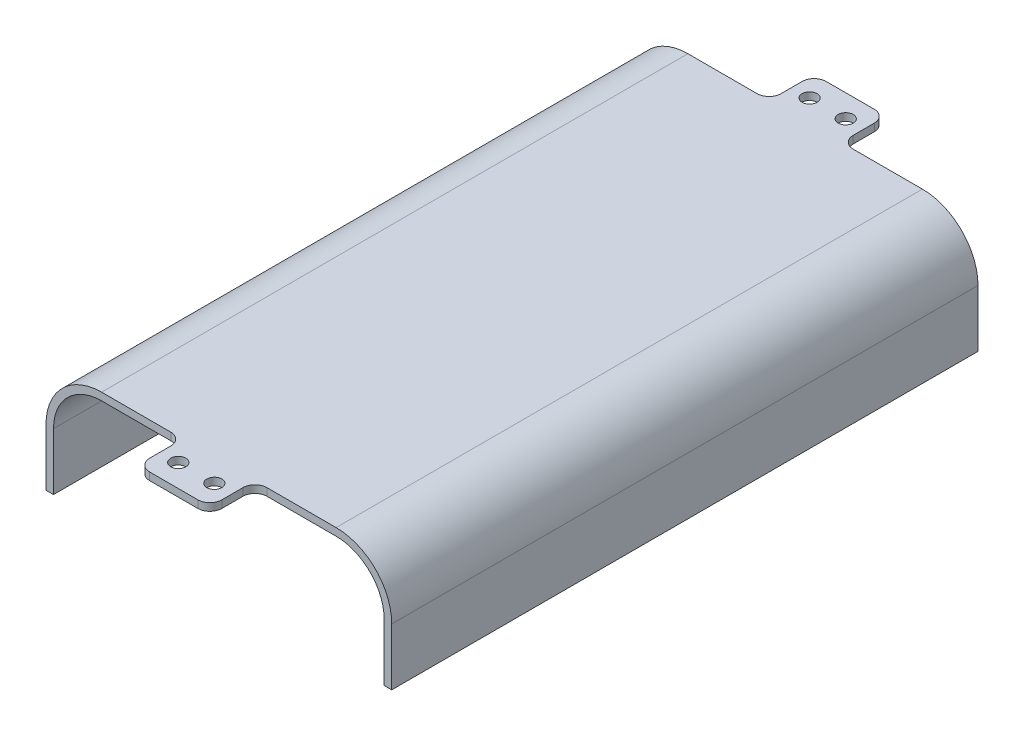
ISO-10303-21;
HEADER;
FILE_DESCRIPTION(('STEP AP214'),'2;1');
FILE_NAME('part.step','',(''),(''),'','','');
FILE_SCHEMA(('AUTOMOTIVE_DESIGN { 1 0 10303 214 1 1 1 1 }'));
ENDSEC;
DATA;
#1=APPLICATION_CONTEXT('core data for automotive mechanical design processes');
#2=APPLICATION_PROTOCOL_DEFINITION('international standard','automotive_design',2000,#1);
#3=PRODUCT_CONTEXT('',#1,'mechanical');
#4=PRODUCT('Part','Part','',(#3));
#5=PRODUCT_RELATED_PRODUCT_CATEGORY('part','',(#4));
#6=PRODUCT_DEFINITION_FORMATION('','',#4);
#7=PRODUCT_DEFINITION_CONTEXT('part definition',#1,'design');
#8=PRODUCT_DEFINITION('design','',#6,#7);
#9=PRODUCT_DEFINITION_SHAPE('','',#8);
#10=(LENGTH_UNIT() NAMED_UNIT(*) SI_UNIT(.MILLI.,.METRE.));
#11=(NAMED_UNIT(*) PLANE_ANGLE_UNIT() SI_UNIT($,.RADIAN.));
#12=(NAMED_UNIT(*) SI_UNIT($,.STERADIAN.) SOLID_ANGLE_UNIT());
#13=UNCERTAINTY_MEASURE_WITH_UNIT(LENGTH_MEASURE(1.E-05),#10,'distance_accuracy_value','');
#14=(GEOMETRIC_REPRESENTATION_CONTEXT(3) GLOBAL_UNCERTAINTY_ASSIGNED_CONTEXT((#13)) GLOBAL_UNIT_ASSIGNED_CONTEXT((#10,
#11,#12)) REPRESENTATION_CONTEXT('',''));
#15=CARTESIAN_POINT('',(0.,0.,0.));
#16=DIRECTION('',(0.,0.,1.));
#17=DIRECTION('',(1.,0.,0.));
#18=AXIS2_PLACEMENT_3D('',#15,#16,#17);
#19=CARTESIAN_POINT('',(-39.,1.50000000000002,225.));
#20=DIRECTION('',(0.,0.,1.));
#21=DIRECTION('',(1.,0.,0.));
#22=AXIS2_PLACEMENT_3D('',#19,#20,#21);
#23=PLANE('',#22);
#24=DIRECTION('',(-1.,0.,0.));
#25=VECTOR('',#24,1.);
#26=CARTESIAN_POINT('',(-39.,20.,225.));
#27=LINE('',#26,#25);
#28=CARTESIAN_POINT('',(7.99999999999997,20.,225.));
#29=VERTEX_POINT('',#28);
#30=CARTESIAN_POINT('',(-7.99999999999997,20.,225.));
#31=VERTEX_POINT('',#30);
#32=EDGE_CURVE('E421',#29,#31,#27,.T.);
#33=ORIENTED_EDGE('',*,*,#32,.T.);
#34=DIRECTION('',(0.,1.,0.));
#35=VECTOR('',#34,1.);
#36=CARTESIAN_POINT('',(-7.99999999999997,-17.5,225.));
#37=LINE('',#36,#35);
#38=CARTESIAN_POINT('',(-7.99999999999997,17.5,225.));
#39=VERTEX_POINT('',#38);
#40=EDGE_CURVE('E277',#39,#31,#37,.T.);
#41=ORIENTED_EDGE('',*,*,#40,.F.);
#42=DIRECTION('',(-1.,0.,0.));
#43=VECTOR('',#42,1.);
#44=CARTESIAN_POINT('',(-39.,17.5,225.));
#45=LINE('',#44,#43);
#46=CARTESIAN_POINT('',(7.99999999999997,17.5,225.));
#47=VERTEX_POINT('',#46);
#48=EDGE_CURVE('E379',#47,#39,#45,.T.);
#49=ORIENTED_EDGE('',*,*,#48,.F.);
#50=DIRECTION('',(0.,1.,0.));
#51=VECTOR('',#50,1.);
#52=CARTESIAN_POINT('',(7.99999999999997,-17.5,225.));
#53=LINE('',#52,#51);
#54=EDGE_CURVE('E336',#47,#29,#53,.T.);
#55=ORIENTED_EDGE('',*,*,#54,.T.);
#56=EDGE_LOOP('',(#33,#41,#49,#55));
#57=FACE_BOUND('',#56,.T.);
#58=ADVANCED_FACE('F41',(#57),#23,.T.);
#59=CARTESIAN_POINT('',(-39.,1.50000000000002,0.));
#60=DIRECTION('',(0.,0.,1.));
#61=DIRECTION('',(1.,0.,0.));
#62=AXIS2_PLACEMENT_3D('',#59,#60,#61);
#63=PLANE('',#62);
#64=DIRECTION('',(0.,1.,0.));
#65=VECTOR('',#64,1.);
#66=CARTESIAN_POINT('',(-7.99999999999997,-17.5,0.));
#67=LINE('',#66,#65);
#68=CARTESIAN_POINT('',(-7.99999999999997,17.5,0.));
#69=VERTEX_POINT('',#68);
#70=CARTESIAN_POINT('',(-7.99999999999997,20.,0.));
#71=VERTEX_POINT('',#70);
#72=EDGE_CURVE('E262',#69,#71,#67,.T.);
#73=ORIENTED_EDGE('',*,*,#72,.T.);
#74=DIRECTION('',(-1.,0.,0.));
#75=VECTOR('',#74,1.);
#76=CARTESIAN_POINT('',(-39.,20.,0.));
#77=LINE('',#76,#75);
#78=CARTESIAN_POINT('',(7.99999999999997,20.,0.));
#79=VERTEX_POINT('',#78);
#80=EDGE_CURVE('E404',#79,#71,#77,.T.);
#81=ORIENTED_EDGE('',*,*,#80,.F.);
#82=DIRECTION('',(0.,1.,0.));
#83=VECTOR('',#82,1.);
#84=CARTESIAN_POINT('',(7.99999999999997,-17.5,0.));
#85=LINE('',#84,#83);
#86=CARTESIAN_POINT('',(7.99999999999997,17.5,0.));
#87=VERTEX_POINT('',#86);
#88=EDGE_CURVE('E272',#87,#79,#85,.T.);
#89=ORIENTED_EDGE('',*,*,#88,.F.);
#90=DIRECTION('',(-1.,0.,0.));
#91=VECTOR('',#90,1.);
#92=CARTESIAN_POINT('',(-39.,17.5,0.));
#93=LINE('',#92,#91);
#94=EDGE_CURVE('E383',#87,#69,#93,.T.);
#95=ORIENTED_EDGE('',*,*,#94,.T.);
#96=EDGE_LOOP('',(#73,#81,#89,#95));
#97=FACE_BOUND('',#96,.T.);
#98=ADVANCED_FACE('F520',(#97),#63,.F.);
#99=CARTESIAN_POINT('',(-55.,-17.5,225.));
#100=DIRECTION('',(0.,1.,0.));
#101=DIRECTION('',(0.,0.,1.));
#102=AXIS2_PLACEMENT_3D('',#99,#100,#101);
#103=PLANE('',#102);
#104=DIRECTION('',(0.,0.,-1.));
#105=VECTOR('',#104,1.);
#106=CARTESIAN_POINT('',(-55.,-17.5,225.));
#107=LINE('',#106,#105);
#108=CARTESIAN_POINT('',(-55.,-17.5,210.));
#109=VERTEX_POINT('',#108);
#110=CARTESIAN_POINT('',(-55.,-17.5,15.));
#111=VERTEX_POINT('',#110);
#112=EDGE_CURVE('E389',#109,#111,#107,.T.);
#113=ORIENTED_EDGE('',*,*,#112,.F.);
#114=DIRECTION('',(-1.,0.,0.));
#115=VECTOR('',#114,1.);
#116=CARTESIAN_POINT('',(-16.,-17.5,210.));
#117=LINE('',#116,#115);
#118=CARTESIAN_POINT('',(-57.5,-17.5,210.));
#119=VERTEX_POINT('',#118);
#120=EDGE_CURVE('E297',#109,#119,#117,.T.);
#121=ORIENTED_EDGE('',*,*,#120,.T.);
#122=DIRECTION('',(0.,0.,-1.));
#123=VECTOR('',#122,1.);
#124=CARTESIAN_POINT('',(-57.5,-17.5,225.));
#125=LINE('',#124,#123);
#126=CARTESIAN_POINT('',(-57.5,-17.5,15.));
#127=VERTEX_POINT('',#126);
#128=EDGE_CURVE('E417',#119,#127,#125,.T.);
#129=ORIENTED_EDGE('',*,*,#128,.T.);
#130=DIRECTION('',(1.,0.,0.));
#131=VECTOR('',#130,1.);
#132=CARTESIAN_POINT('',(-16.,-17.5,15.));
#133=LINE('',#132,#131);
#134=EDGE_CURVE('E237',#127,#111,#133,.T.);
#135=ORIENTED_EDGE('',*,*,#134,.T.);
#136=EDGE_LOOP('',(#113,#121,#129,#135));
#137=FACE_BOUND('',#136,.T.);
#138=ADVANCED_FACE('F499',(#137),#103,.F.);
#139=CARTESIAN_POINT('',(57.5,1.50000000000002,225.));
#140=DIRECTION('',(-1.,0.,0.));
#141=DIRECTION('',(0.,0.,1.));
#142=AXIS2_PLACEMENT_3D('',#139,#140,#141);
#143=PLANE('',#142);
#144=DIRECTION('',(0.,0.,-1.));
#145=VECTOR('',#144,1.);
#146=CARTESIAN_POINT('',(57.5,-17.5,225.));
#147=LINE('',#146,#145);
#148=CARTESIAN_POINT('',(57.5,-17.5,210.));
#149=VERTEX_POINT('',#148);
#150=CARTESIAN_POINT('',(57.5,-17.5,15.));
#151=VERTEX_POINT('',#150);
#152=EDGE_CURVE('E418',#149,#151,#147,.T.);
#153=ORIENTED_EDGE('',*,*,#152,.T.);
#154=DIRECTION('',(0.,1.,0.));
#155=VECTOR('',#154,1.);
#156=CARTESIAN_POINT('',(57.5,1.50000000000002,15.));
#157=LINE('',#156,#155);
#158=CARTESIAN_POINT('',(57.5,1.50000000000002,15.));
#159=VERTEX_POINT('',#158);
#160=EDGE_CURVE('E375',#151,#159,#157,.T.);
#161=ORIENTED_EDGE('',*,*,#160,.T.);
#162=DIRECTION('',(0.,0.,-1.));
#163=VECTOR('',#162,1.);
#164=CARTESIAN_POINT('',(57.5,1.50000000000002,225.));
#165=LINE('',#164,#163);
#166=CARTESIAN_POINT('',(57.5,1.50000000000002,210.));
#167=VERTEX_POINT('',#166);
#168=EDGE_CURVE('E405',#167,#159,#165,.T.);
#169=ORIENTED_EDGE('',*,*,#168,.F.);
#170=DIRECTION('',(0.,-1.,0.));
#171=VECTOR('',#170,1.);
#172=CARTESIAN_POINT('',(57.5,1.50000000000002,210.));
#173=LINE('',#172,#171);
#174=EDGE_CURVE('E365',#167,#149,#173,.T.);
#175=ORIENTED_EDGE('',*,*,#174,.T.);
#176=EDGE_LOOP('',(#153,#161,#169,#175));
#177=FACE_BOUND('',#176,.T.);
#178=ADVANCED_FACE('F559',(#177),#143,.F.);
#179=CARTESIAN_POINT('',(39.,1.50000000000002,225.));
#180=DIRECTION('',(0.,0.,-1.));
#181=DIRECTION('',(-1.,0.,0.));
#182=AXIS2_PLACEMENT_3D('',#179,#180,#181);
#183=CYLINDRICAL_SURFACE('',#182,18.5);
#184=ORIENTED_EDGE('',*,*,#168,.T.);
#185=CARTESIAN_POINT('',(39.,1.50000000000002,15.));
#186=DIRECTION('',(0.,0.,1.));
#187=DIRECTION('',(1.,0.,0.));
#188=AXIS2_PLACEMENT_3D('',#185,#186,#187);
#189=CIRCLE('',#188,18.5);
#190=CARTESIAN_POINT('',(39.,20.,15.));
#191=VERTEX_POINT('',#190);
#192=EDGE_CURVE('E372',#159,#191,#189,.T.);
#193=ORIENTED_EDGE('',*,*,#192,.T.);
#194=DIRECTION('',(0.,0.,-1.));
#195=VECTOR('',#194,1.);
#196=CARTESIAN_POINT('',(39.,20.,225.));
#197=LINE('',#196,#195);
#198=CARTESIAN_POINT('',(39.,20.,210.));
#199=VERTEX_POINT('',#198);
#200=EDGE_CURVE('E409',#199,#191,#197,.T.);
#201=ORIENTED_EDGE('',*,*,#200,.F.);
#202=CARTESIAN_POINT('',(39.,1.50000000000002,210.));
#203=DIRECTION('',(0.,0.,-1.));
#204=DIRECTION('',(-1.,0.,0.));
#205=AXIS2_PLACEMENT_3D('',#202,#203,#204);
#206=CIRCLE('',#205,18.5);
#207=EDGE_CURVE('E362',#199,#167,#206,.T.);
#208=ORIENTED_EDGE('',*,*,#207,.T.);
#209=EDGE_LOOP('',(#184,#193,#201,#208));
#210=FACE_BOUND('',#209,.T.);
#211=ADVANCED_FACE('F561',(#210),#183,.T.);
#212=CARTESIAN_POINT('',(-39.,20.,225.));
#213=DIRECTION('',(0.,-1.,0.));
#214=DIRECTION('',(0.,0.,-1.));
#215=AXIS2_PLACEMENT_3D('',#212,#213,#214);
#216=PLANE('',#215);
#217=CARTESIAN_POINT('',(6.,20.,217.5));
#218=DIRECTION('',(0.,1.,0.));
#219=DIRECTION('',(0.,0.,-1.));
#220=AXIS2_PLACEMENT_3D('',#217,#218,#219);
#221=CIRCLE('',#220,2.5);
#222=CARTESIAN_POINT('',(6.,20.,215.));
#223=VERTEX_POINT('',#222);
#224=EDGE_CURVE('E296',#223,#223,#221,.T.);
#225=ORIENTED_EDGE('',*,*,#224,.F.);
#226=EDGE_LOOP('',(#225));
#227=FACE_BOUND('',#226,.T.);
#228=CARTESIAN_POINT('',(-6.,20.,217.5));
#229=DIRECTION('',(0.,1.,0.));
#230=DIRECTION('',(0.,0.,-1.));
#231=AXIS2_PLACEMENT_3D('',#228,#229,#230);
#232=CIRCLE('',#231,2.5);
#233=CARTESIAN_POINT('',(-6.,20.,215.));
#234=VERTEX_POINT('',#233);
#235=EDGE_CURVE('E293',#234,#234,#232,.T.);
#236=ORIENTED_EDGE('',*,*,#235,.F.);
#237=EDGE_LOOP('',(#236));
#238=FACE_BOUND('',#237,.T.);
#239=CARTESIAN_POINT('',(-6.,20.,7.5));
#240=DIRECTION('',(0.,1.,0.));
#241=DIRECTION('',(0.,0.,1.));
#242=AXIS2_PLACEMENT_3D('',#239,#240,#241);
#243=CIRCLE('',#242,2.5);
#244=CARTESIAN_POINT('',(-6.,20.,10.));
#245=VERTEX_POINT('',#244);
#246=EDGE_CURVE('E287',#245,#245,#243,.T.);
#247=ORIENTED_EDGE('',*,*,#246,.F.);
#248=EDGE_LOOP('',(#247));
#249=FACE_BOUND('',#248,.T.);
#250=CARTESIAN_POINT('',(6.,20.,7.5));
#251=DIRECTION('',(0.,1.,0.));
#252=DIRECTION('',(0.,0.,1.));
#253=AXIS2_PLACEMENT_3D('',#250,#251,#252);
#254=CIRCLE('',#253,2.5);
#255=CARTESIAN_POINT('',(6.,20.,10.));
#256=VERTEX_POINT('',#255);
#257=EDGE_CURVE('E265',#256,#256,#254,.T.);
#258=ORIENTED_EDGE('',*,*,#257,.F.);
#259=EDGE_LOOP('',(#258));
#260=FACE_BOUND('',#259,.T.);
#261=DIRECTION('',(0.,0.,-1.));
#262=VECTOR('',#261,1.);
#263=CARTESIAN_POINT('',(-12.,20.,221.));
#264=LINE('',#263,#262);
#265=CARTESIAN_POINT('',(-12.,20.,221.));
#266=VERTEX_POINT('',#265);
#267=CARTESIAN_POINT('',(-12.,20.,214.));
#268=VERTEX_POINT('',#267);
#269=EDGE_CURVE('E305',#266,#268,#264,.T.);
#270=ORIENTED_EDGE('',*,*,#269,.F.);
#271=CARTESIAN_POINT('',(-8.,20.,221.));
#272=DIRECTION('',(0.,-1.,0.));
#273=DIRECTION('',(0.,0.,1.));
#274=AXIS2_PLACEMENT_3D('',#271,#272,#273);
#275=CIRCLE('',#274,4.);
#276=EDGE_CURVE('E302',#31,#266,#275,.T.);
#277=ORIENTED_EDGE('',*,*,#276,.F.);
#278=ORIENTED_EDGE('',*,*,#32,.F.);
#279=CARTESIAN_POINT('',(8.,20.,221.));
#280=DIRECTION('',(0.,-1.,0.));
#281=DIRECTION('',(0.,0.,-1.));
#282=AXIS2_PLACEMENT_3D('',#279,#280,#281);
#283=CIRCLE('',#282,4.);
#284=CARTESIAN_POINT('',(12.,20.,221.));
#285=VERTEX_POINT('',#284);
#286=EDGE_CURVE('E329',#285,#29,#283,.T.);
#287=ORIENTED_EDGE('',*,*,#286,.F.);
#288=DIRECTION('',(0.,0.,1.));
#289=VECTOR('',#288,1.);
#290=CARTESIAN_POINT('',(12.,20.,221.));
#291=LINE('',#290,#289);
#292=CARTESIAN_POINT('',(12.,20.,214.));
#293=VERTEX_POINT('',#292);
#294=EDGE_CURVE('E327',#293,#285,#291,.T.);
#295=ORIENTED_EDGE('',*,*,#294,.F.);
#296=CARTESIAN_POINT('',(16.,20.,214.));
#297=DIRECTION('',(0.,1.,0.));
#298=DIRECTION('',(0.,0.,1.));
#299=AXIS2_PLACEMENT_3D('',#296,#297,#298);
#300=CIRCLE('',#299,4.00000000000002);
#301=CARTESIAN_POINT('',(16.,20.,210.));
#302=VERTEX_POINT('',#301);
#303=EDGE_CURVE('E290',#302,#293,#300,.T.);
#304=ORIENTED_EDGE('',*,*,#303,.F.);
#305=DIRECTION('',(-1.,0.,0.));
#306=VECTOR('',#305,1.);
#307=CARTESIAN_POINT('',(16.,20.,210.));
#308=LINE('',#307,#306);
#309=EDGE_CURVE('E324',#199,#302,#308,.T.);
#310=ORIENTED_EDGE('',*,*,#309,.F.);
#311=ORIENTED_EDGE('',*,*,#200,.T.);
#312=DIRECTION('',(1.,0.,0.));
#313=VECTOR('',#312,1.);
#314=CARTESIAN_POINT('',(16.,20.,15.));
#315=LINE('',#314,#313);
#316=CARTESIAN_POINT('',(16.,20.,15.));
#317=VERTEX_POINT('',#316);
#318=EDGE_CURVE('E273',#317,#191,#315,.T.);
#319=ORIENTED_EDGE('',*,*,#318,.F.);
#320=CARTESIAN_POINT('',(16.,20.,11.));
#321=DIRECTION('',(0.,1.,0.));
#322=DIRECTION('',(0.,0.,-1.));
#323=AXIS2_PLACEMENT_3D('',#320,#321,#322);
#324=CIRCLE('',#323,4.);
#325=CARTESIAN_POINT('',(12.,20.,11.));
#326=VERTEX_POINT('',#325);
#327=EDGE_CURVE('E280',#326,#317,#324,.T.);
#328=ORIENTED_EDGE('',*,*,#327,.F.);
#329=DIRECTION('',(0.,0.,1.));
#330=VECTOR('',#329,1.);
#331=CARTESIAN_POINT('',(12.,20.,4.));
#332=LINE('',#331,#330);
#333=CARTESIAN_POINT('',(12.,20.,4.));
#334=VERTEX_POINT('',#333);
#335=EDGE_CURVE('E276',#334,#326,#332,.T.);
#336=ORIENTED_EDGE('',*,*,#335,.F.);
#337=CARTESIAN_POINT('',(8.,20.,4.));
#338=DIRECTION('',(0.,-1.,0.));
#339=DIRECTION('',(0.,0.,1.));
#340=AXIS2_PLACEMENT_3D('',#337,#338,#339);
#341=CIRCLE('',#340,4.);
#342=EDGE_CURVE('E274',#79,#334,#341,.T.);
#343=ORIENTED_EDGE('',*,*,#342,.F.);
#344=ORIENTED_EDGE('',*,*,#80,.T.);
#345=CARTESIAN_POINT('',(-8.,20.,4.));
#346=DIRECTION('',(0.,-1.,0.));
#347=DIRECTION('',(0.,0.,-1.));
#348=AXIS2_PLACEMENT_3D('',#345,#346,#347);
#349=CIRCLE('',#348,4.);
#350=CARTESIAN_POINT('',(-12.,20.,4.));
#351=VERTEX_POINT('',#350);
#352=EDGE_CURVE('E247',#351,#71,#349,.T.);
#353=ORIENTED_EDGE('',*,*,#352,.F.);
#354=DIRECTION('',(0.,0.,-1.));
#355=VECTOR('',#354,1.);
#356=CARTESIAN_POINT('',(-12.,20.,4.));
#357=LINE('',#356,#355);
#358=CARTESIAN_POINT('',(-12.,20.,11.));
#359=VERTEX_POINT('',#358);
#360=EDGE_CURVE('E253',#359,#351,#357,.T.);
#361=ORIENTED_EDGE('',*,*,#360,.F.);
#362=CARTESIAN_POINT('',(-16.,20.,11.));
#363=DIRECTION('',(0.,1.,0.));
#364=DIRECTION('',(0.,0.,-1.));
#365=AXIS2_PLACEMENT_3D('',#362,#363,#364);
#366=CIRCLE('',#365,4.);
#367=CARTESIAN_POINT('',(-16.,20.,15.));
#368=VERTEX_POINT('',#367);
#369=EDGE_CURVE('E230',#368,#359,#366,.T.);
#370=ORIENTED_EDGE('',*,*,#369,.F.);
#371=DIRECTION('',(1.,0.,0.));
#372=VECTOR('',#371,1.);
#373=CARTESIAN_POINT('',(-68.033168474898,20.,15.));
#374=LINE('',#373,#372);
#375=CARTESIAN_POINT('',(-39.,20.,15.));
#376=VERTEX_POINT('',#375);
#377=EDGE_CURVE('E240',#376,#368,#374,.T.);
#378=ORIENTED_EDGE('',*,*,#377,.F.);
#379=DIRECTION('',(0.,0.,-1.));
#380=VECTOR('',#379,1.);
#381=CARTESIAN_POINT('',(-39.,20.,225.));
#382=LINE('',#381,#380);
#383=CARTESIAN_POINT('',(-39.,20.,210.));
#384=VERTEX_POINT('',#383);
#385=EDGE_CURVE('E412',#384,#376,#382,.T.);
#386=ORIENTED_EDGE('',*,*,#385,.F.);
#387=DIRECTION('',(-1.,0.,0.));
#388=VECTOR('',#387,1.);
#389=CARTESIAN_POINT('',(-68.033168474898,20.,210.));
#390=LINE('',#389,#388);
#391=CARTESIAN_POINT('',(-16.,20.,210.));
#392=VERTEX_POINT('',#391);
#393=EDGE_CURVE('E301',#392,#384,#390,.T.);
#394=ORIENTED_EDGE('',*,*,#393,.F.);
#395=CARTESIAN_POINT('',(-16.,20.,214.));
#396=DIRECTION('',(0.,1.,0.));
#397=DIRECTION('',(0.,0.,1.));
#398=AXIS2_PLACEMENT_3D('',#395,#396,#397);
#399=CIRCLE('',#398,3.99999999999999);
#400=EDGE_CURVE('E308',#268,#392,#399,.T.);
#401=ORIENTED_EDGE('',*,*,#400,.F.);
#402=EDGE_LOOP('',(#270,#277,#278,#287,#295,#304,#310,#311,#319,#328,#336,#343,#344,#353,#361,
#370,#378,#386,#394,#401));
#403=FACE_BOUND('',#402,.T.);
#404=ADVANCED_FACE('F250',(#227,#238,#249,#260,#403),#216,.F.);
#405=CARTESIAN_POINT('',(-39.,1.50000000000002,225.));
#406=DIRECTION('',(0.,0.,-1.));
#407=DIRECTION('',(-1.,0.,0.));
#408=AXIS2_PLACEMENT_3D('',#405,#406,#407);
#409=CYLINDRICAL_SURFACE('',#408,18.5);
#410=DIRECTION('',(0.,0.,-1.));
#411=VECTOR('',#410,1.);
#412=CARTESIAN_POINT('',(-57.5,1.50000000000002,225.));
#413=LINE('',#412,#411);
#414=CARTESIAN_POINT('',(-57.5,1.50000000000002,210.));
#415=VERTEX_POINT('',#414);
#416=CARTESIAN_POINT('',(-57.5,1.50000000000002,15.));
#417=VERTEX_POINT('',#416);
#418=EDGE_CURVE('E414',#415,#417,#413,.T.);
#419=ORIENTED_EDGE('',*,*,#418,.F.);
#420=CARTESIAN_POINT('',(-39.,1.50000000000002,210.));
#421=DIRECTION('',(0.,0.,-1.));
#422=DIRECTION('',(-1.,0.,0.));
#423=AXIS2_PLACEMENT_3D('',#420,#421,#422);
#424=CIRCLE('',#423,18.5);
#425=EDGE_CURVE('E355',#415,#384,#424,.T.);
#426=ORIENTED_EDGE('',*,*,#425,.T.);
#427=ORIENTED_EDGE('',*,*,#385,.T.);
#428=CARTESIAN_POINT('',(-39.,1.50000000000002,15.));
#429=DIRECTION('',(0.,0.,1.));
#430=DIRECTION('',(1.,0.,0.));
#431=AXIS2_PLACEMENT_3D('',#428,#429,#430);
#432=CIRCLE('',#431,18.5);
#433=EDGE_CURVE('E243',#376,#417,#432,.T.);
#434=ORIENTED_EDGE('',*,*,#433,.T.);
#435=EDGE_LOOP('',(#419,#426,#427,#434));
#436=FACE_BOUND('',#435,.T.);
#437=ADVANCED_FACE('F493',(#436),#409,.T.);
#438=CARTESIAN_POINT('',(-57.5,1.50000000000002,225.));
#439=DIRECTION('',(1.,0.,0.));
#440=DIRECTION('',(0.,0.,-1.));
#441=AXIS2_PLACEMENT_3D('',#438,#439,#440);
#442=PLANE('',#441);
#443=ORIENTED_EDGE('',*,*,#128,.F.);
#444=DIRECTION('',(0.,1.,0.));
#445=VECTOR('',#444,1.);
#446=CARTESIAN_POINT('',(-57.5,1.50000000000002,210.));
#447=LINE('',#446,#445);
#448=EDGE_CURVE('E352',#119,#415,#447,.T.);
#449=ORIENTED_EDGE('',*,*,#448,.T.);
#450=ORIENTED_EDGE('',*,*,#418,.T.);
#451=DIRECTION('',(0.,-1.,0.));
#452=VECTOR('',#451,1.);
#453=CARTESIAN_POINT('',(-57.5,1.50000000000002,15.));
#454=LINE('',#453,#452);
#455=EDGE_CURVE('E344',#417,#127,#454,.T.);
#456=ORIENTED_EDGE('',*,*,#455,.T.);
#457=EDGE_LOOP('',(#443,#449,#450,#456));
#458=FACE_BOUND('',#457,.T.);
#459=ADVANCED_FACE('F43',(#458),#442,.F.);
#460=DIRECTION('',(0.,0.,-1.));
#461=VECTOR('',#460,1.);
#462=CARTESIAN_POINT('',(55.,-17.5,225.));
#463=LINE('',#462,#461);
#464=CARTESIAN_POINT('',(55.,-17.5,210.));
#465=VERTEX_POINT('',#464);
#466=CARTESIAN_POINT('',(55.,-17.5,15.));
#467=VERTEX_POINT('',#466);
#468=EDGE_CURVE('E382',#465,#467,#463,.T.);
#469=ORIENTED_EDGE('',*,*,#468,.T.);
#470=DIRECTION('',(1.,0.,0.));
#471=VECTOR('',#470,1.);
#472=CARTESIAN_POINT('',(16.,-17.5,15.));
#473=LINE('',#472,#471);
#474=EDGE_CURVE('E269',#467,#151,#473,.T.);
#475=ORIENTED_EDGE('',*,*,#474,.T.);
#476=ORIENTED_EDGE('',*,*,#152,.F.);
#477=DIRECTION('',(-1.,0.,0.));
#478=VECTOR('',#477,1.);
#479=CARTESIAN_POINT('',(16.,-17.5,210.));
#480=LINE('',#479,#478);
#481=EDGE_CURVE('E320',#149,#465,#480,.T.);
#482=ORIENTED_EDGE('',*,*,#481,.T.);
#483=EDGE_LOOP('',(#469,#475,#476,#482));
#484=FACE_BOUND('',#483,.T.);
#485=ADVANCED_FACE('F555',(#484),#103,.F.);
#486=CARTESIAN_POINT('',(55.,1.50000000000002,225.));
#487=DIRECTION('',(-1.,0.,0.));
#488=DIRECTION('',(0.,0.,1.));
#489=AXIS2_PLACEMENT_3D('',#486,#487,#488);
#490=PLANE('',#489);
#491=DIRECTION('',(0.,1.,0.));
#492=VECTOR('',#491,1.);
#493=CARTESIAN_POINT('',(55.,1.50000000000002,15.));
#494=LINE('',#493,#492);
#495=CARTESIAN_POINT('',(55.,1.50000000000002,15.));
#496=VERTEX_POINT('',#495);
#497=EDGE_CURVE('E370',#467,#496,#494,.T.);
#498=ORIENTED_EDGE('',*,*,#497,.F.);
#499=ORIENTED_EDGE('',*,*,#468,.F.);
#500=DIRECTION('',(0.,-1.,0.));
#501=VECTOR('',#500,1.);
#502=CARTESIAN_POINT('',(55.,1.50000000000002,210.));
#503=LINE('',#502,#501);
#504=CARTESIAN_POINT('',(55.,1.50000000000002,210.));
#505=VERTEX_POINT('',#504);
#506=EDGE_CURVE('E360',#505,#465,#503,.T.);
#507=ORIENTED_EDGE('',*,*,#506,.F.);
#508=DIRECTION('',(0.,0.,-1.));
#509=VECTOR('',#508,1.);
#510=CARTESIAN_POINT('',(55.,1.50000000000002,225.));
#511=LINE('',#510,#509);
#512=EDGE_CURVE('E401',#505,#496,#511,.T.);
#513=ORIENTED_EDGE('',*,*,#512,.T.);
#514=EDGE_LOOP('',(#498,#499,#507,#513));
#515=FACE_BOUND('',#514,.T.);
#516=ADVANCED_FACE('F553',(#515),#490,.T.);
#517=CARTESIAN_POINT('',(39.,1.50000000000002,225.));
#518=DIRECTION('',(0.,0.,-1.));
#519=DIRECTION('',(-1.,0.,0.));
#520=AXIS2_PLACEMENT_3D('',#517,#518,#519);
#521=CYLINDRICAL_SURFACE('',#520,16.);
#522=CARTESIAN_POINT('',(39.,1.50000000000002,15.));
#523=DIRECTION('',(0.,0.,1.));
#524=DIRECTION('',(1.,0.,0.));
#525=AXIS2_PLACEMENT_3D('',#522,#523,#524);
#526=CIRCLE('',#525,16.);
#527=CARTESIAN_POINT('',(39.,17.5,15.));
#528=VERTEX_POINT('',#527);
#529=EDGE_CURVE('E368',#496,#528,#526,.T.);
#530=ORIENTED_EDGE('',*,*,#529,.F.);
#531=ORIENTED_EDGE('',*,*,#512,.F.);
#532=CARTESIAN_POINT('',(39.,1.50000000000002,210.));
#533=DIRECTION('',(0.,0.,-1.));
#534=DIRECTION('',(-1.,0.,0.));
#535=AXIS2_PLACEMENT_3D('',#532,#533,#534);
#536=CIRCLE('',#535,16.);
#537=CARTESIAN_POINT('',(39.,17.5,210.));
#538=VERTEX_POINT('',#537);
#539=EDGE_CURVE('E358',#538,#505,#536,.T.);
#540=ORIENTED_EDGE('',*,*,#539,.F.);
#541=DIRECTION('',(0.,0.,-1.));
#542=VECTOR('',#541,1.);
#543=CARTESIAN_POINT('',(39.,17.5,225.));
#544=LINE('',#543,#542);
#545=EDGE_CURVE('E398',#538,#528,#544,.T.);
#546=ORIENTED_EDGE('',*,*,#545,.T.);
#547=EDGE_LOOP('',(#530,#531,#540,#546));
#548=FACE_BOUND('',#547,.T.);
#549=ADVANCED_FACE('F544',(#548),#521,.F.);
#550=CARTESIAN_POINT('',(-39.,17.5,225.));
#551=DIRECTION('',(0.,-1.,0.));
#552=DIRECTION('',(0.,0.,-1.));
#553=AXIS2_PLACEMENT_3D('',#550,#551,#552);
#554=PLANE('',#553);
#555=CARTESIAN_POINT('',(-8.,17.5,221.));
#556=DIRECTION('',(0.,-1.,0.));
#557=DIRECTION('',(0.,0.,-1.));
#558=AXIS2_PLACEMENT_3D('',#555,#556,#557);
#559=CIRCLE('',#558,4.);
#560=CARTESIAN_POINT('',(-12.,17.5,221.));
#561=VERTEX_POINT('',#560);
#562=EDGE_CURVE('E11',#561,#39,#559,.F.);
#563=ORIENTED_EDGE('',*,*,#562,.F.);
#564=DIRECTION('',(0.,0.,1.));
#565=VECTOR('',#564,1.);
#566=CARTESIAN_POINT('',(-12.,17.5,225.));
#567=LINE('',#566,#565);
#568=CARTESIAN_POINT('',(-12.,17.5,214.));
#569=VERTEX_POINT('',#568);
#570=EDGE_CURVE('E452',#569,#561,#567,.T.);
#571=ORIENTED_EDGE('',*,*,#570,.F.);
#572=CARTESIAN_POINT('',(-16.,17.5,214.));
#573=DIRECTION('',(0.,-1.,0.));
#574=DIRECTION('',(0.,0.,-1.));
#575=AXIS2_PLACEMENT_3D('',#572,#573,#574);
#576=CIRCLE('',#575,3.99999999999999);
#577=CARTESIAN_POINT('',(-16.,17.5,210.));
#578=VERTEX_POINT('',#577);
#579=EDGE_CURVE('E49',#578,#569,#576,.T.);
#580=ORIENTED_EDGE('',*,*,#579,.F.);
#581=DIRECTION('',(1.,0.,0.));
#582=VECTOR('',#581,1.);
#583=CARTESIAN_POINT('',(-39.,17.5,210.));
#584=LINE('',#583,#582);
#585=CARTESIAN_POINT('',(-39.,17.5,210.));
#586=VERTEX_POINT('',#585);
#587=EDGE_CURVE('E350',#586,#578,#584,.T.);
#588=ORIENTED_EDGE('',*,*,#587,.F.);
#589=DIRECTION('',(0.,0.,-1.));
#590=VECTOR('',#589,1.);
#591=CARTESIAN_POINT('',(-39.,17.5,225.));
#592=LINE('',#591,#590);
#593=CARTESIAN_POINT('',(-39.,17.5,15.));
#594=VERTEX_POINT('',#593);
#595=EDGE_CURVE('E395',#586,#594,#592,.T.);
#596=ORIENTED_EDGE('',*,*,#595,.T.);
#597=DIRECTION('',(-1.,0.,0.));
#598=VECTOR('',#597,1.);
#599=CARTESIAN_POINT('',(-39.,17.5,15.));
#600=LINE('',#599,#598);
#601=CARTESIAN_POINT('',(-16.,17.5,15.));
#602=VERTEX_POINT('',#601);
#603=EDGE_CURVE('E342',#602,#594,#600,.T.);
#604=ORIENTED_EDGE('',*,*,#603,.F.);
#605=CARTESIAN_POINT('',(-16.,17.5,11.));
#606=DIRECTION('',(0.,-1.,0.));
#607=DIRECTION('',(0.,0.,-1.));
#608=AXIS2_PLACEMENT_3D('',#605,#606,#607);
#609=CIRCLE('',#608,4.);
#610=CARTESIAN_POINT('',(-12.,17.5,11.));
#611=VERTEX_POINT('',#610);
#612=EDGE_CURVE('E233',#611,#602,#609,.T.);
#613=ORIENTED_EDGE('',*,*,#612,.F.);
#614=DIRECTION('',(0.,0.,1.));
#615=VECTOR('',#614,1.);
#616=CARTESIAN_POINT('',(-11.9999999999999,17.5,225.));
#617=LINE('',#616,#615);
#618=CARTESIAN_POINT('',(-12.,17.5,4.));
#619=VERTEX_POINT('',#618);
#620=EDGE_CURVE('E448',#619,#611,#617,.T.);
#621=ORIENTED_EDGE('',*,*,#620,.F.);
#622=CARTESIAN_POINT('',(-8.,17.5,4.));
#623=DIRECTION('',(0.,-1.,0.));
#624=DIRECTION('',(0.,0.,-1.));
#625=AXIS2_PLACEMENT_3D('',#622,#623,#624);
#626=CIRCLE('',#625,4.);
#627=EDGE_CURVE('E450',#69,#619,#626,.F.);
#628=ORIENTED_EDGE('',*,*,#627,.F.);
#629=ORIENTED_EDGE('',*,*,#94,.F.);
#630=CARTESIAN_POINT('',(8.,17.5,4.));
#631=DIRECTION('',(0.,-1.,0.));
#632=DIRECTION('',(0.,0.,-1.));
#633=AXIS2_PLACEMENT_3D('',#630,#631,#632);
#634=CIRCLE('',#633,4.);
#635=CARTESIAN_POINT('',(12.,17.5,4.));
#636=VERTEX_POINT('',#635);
#637=EDGE_CURVE('E439',#636,#87,#634,.F.);
#638=ORIENTED_EDGE('',*,*,#637,.F.);
#639=DIRECTION('',(0.,0.,-1.));
#640=VECTOR('',#639,1.);
#641=CARTESIAN_POINT('',(12.,17.5,225.));
#642=LINE('',#641,#640);
#643=CARTESIAN_POINT('',(12.,17.5,11.));
#644=VERTEX_POINT('',#643);
#645=EDGE_CURVE('E441',#644,#636,#642,.T.);
#646=ORIENTED_EDGE('',*,*,#645,.F.);
#647=CARTESIAN_POINT('',(16.,17.5,11.));
#648=DIRECTION('',(0.,-1.,0.));
#649=DIRECTION('',(0.,0.,-1.));
#650=AXIS2_PLACEMENT_3D('',#647,#648,#649);
#651=CIRCLE('',#650,4.);
#652=CARTESIAN_POINT('',(16.,17.5,15.));
#653=VERTEX_POINT('',#652);
#654=EDGE_CURVE('E443',#653,#644,#651,.T.);
#655=ORIENTED_EDGE('',*,*,#654,.F.);
#656=DIRECTION('',(-1.,0.,0.));
#657=VECTOR('',#656,1.);
#658=CARTESIAN_POINT('',(-39.,17.5,15.));
#659=LINE('',#658,#657);
#660=EDGE_CURVE('E445',#528,#653,#659,.T.);
#661=ORIENTED_EDGE('',*,*,#660,.F.);
#662=ORIENTED_EDGE('',*,*,#545,.F.);
#663=DIRECTION('',(1.,0.,0.));
#664=VECTOR('',#663,1.);
#665=CARTESIAN_POINT('',(-39.,17.5,210.));
#666=LINE('',#665,#664);
#667=CARTESIAN_POINT('',(16.,17.5,210.));
#668=VERTEX_POINT('',#667);
#669=EDGE_CURVE('E437',#668,#538,#666,.T.);
#670=ORIENTED_EDGE('',*,*,#669,.F.);
#671=CARTESIAN_POINT('',(16.,17.5,214.));
#672=DIRECTION('',(0.,-1.,0.));
#673=DIRECTION('',(0.,0.,-1.));
#674=AXIS2_PLACEMENT_3D('',#671,#672,#673);
#675=CIRCLE('',#674,4.00000000000002);
#676=CARTESIAN_POINT('',(12.,17.5,214.));
#677=VERTEX_POINT('',#676);
#678=EDGE_CURVE('E435',#677,#668,#675,.T.);
#679=ORIENTED_EDGE('',*,*,#678,.F.);
#680=DIRECTION('',(0.,0.,-1.));
#681=VECTOR('',#680,1.);
#682=CARTESIAN_POINT('',(12.,17.5,225.));
#683=LINE('',#682,#681);
#684=CARTESIAN_POINT('',(12.,17.5,221.));
#685=VERTEX_POINT('',#684);
#686=EDGE_CURVE('E431',#685,#677,#683,.T.);
#687=ORIENTED_EDGE('',*,*,#686,.F.);
#688=CARTESIAN_POINT('',(8.,17.5,221.));
#689=DIRECTION('',(0.,-1.,0.));
#690=DIRECTION('',(0.,0.,-1.));
#691=AXIS2_PLACEMENT_3D('',#688,#689,#690);
#692=CIRCLE('',#691,4.);
#693=EDGE_CURVE('E433',#47,#685,#692,.F.);
#694=ORIENTED_EDGE('',*,*,#693,.F.);
#695=ORIENTED_EDGE('',*,*,#48,.T.);
#696=EDGE_LOOP('',(#563,#571,#580,#588,#596,#604,#613,#621,#628,#629,#638,#646,#655,#661,#662,
#670,#679,#687,#694,#695));
#697=FACE_BOUND('',#696,.T.);
#698=CARTESIAN_POINT('',(6.,17.5,217.5));
#699=DIRECTION('',(0.,-1.,0.));
#700=DIRECTION('',(0.,0.,-1.));
#701=AXIS2_PLACEMENT_3D('',#698,#699,#700);
#702=CIRCLE('',#701,2.5);
#703=CARTESIAN_POINT('',(6.,17.5,215.));
#704=VERTEX_POINT('',#703);
#705=EDGE_CURVE('E386',#704,#704,#702,.T.);
#706=ORIENTED_EDGE('',*,*,#705,.F.);
#707=EDGE_LOOP('',(#706));
#708=FACE_BOUND('',#707,.T.);
#709=CARTESIAN_POINT('',(-6.,17.5,217.5));
#710=DIRECTION('',(0.,-1.,0.));
#711=DIRECTION('',(0.,0.,-1.));
#712=AXIS2_PLACEMENT_3D('',#709,#710,#711);
#713=CIRCLE('',#712,2.5);
#714=CARTESIAN_POINT('',(-6.,17.5,215.));
#715=VERTEX_POINT('',#714);
#716=EDGE_CURVE('E458',#715,#715,#713,.T.);
#717=ORIENTED_EDGE('',*,*,#716,.F.);
#718=EDGE_LOOP('',(#717));
#719=FACE_BOUND('',#718,.T.);
#720=CARTESIAN_POINT('',(-6.,17.5,7.5));
#721=DIRECTION('',(0.,-1.,0.));
#722=DIRECTION('',(0.,0.,-1.));
#723=AXIS2_PLACEMENT_3D('',#720,#721,#722);
#724=CIRCLE('',#723,2.5);
#725=CARTESIAN_POINT('',(-6.,17.5,5.));
#726=VERTEX_POINT('',#725);
#727=EDGE_CURVE('E455',#726,#726,#724,.T.);
#728=ORIENTED_EDGE('',*,*,#727,.F.);
#729=EDGE_LOOP('',(#728));
#730=FACE_BOUND('',#729,.T.);
#731=CARTESIAN_POINT('',(6.,17.5,7.5));
#732=DIRECTION('',(0.,-1.,0.));
#733=DIRECTION('',(0.,0.,-1.));
#734=AXIS2_PLACEMENT_3D('',#731,#732,#733);
#735=CIRCLE('',#734,2.5);
#736=CARTESIAN_POINT('',(6.,17.5,5.));
#737=VERTEX_POINT('',#736);
#738=EDGE_CURVE('E378',#737,#737,#735,.T.);
#739=ORIENTED_EDGE('',*,*,#738,.F.);
#740=EDGE_LOOP('',(#739));
#741=FACE_BOUND('',#740,.T.);
#742=ADVANCED_FACE('F476',(#697,#708,#719,#730,#741),#554,.T.);
#743=CARTESIAN_POINT('',(-39.,1.50000000000002,225.));
#744=DIRECTION('',(0.,0.,-1.));
#745=DIRECTION('',(-1.,0.,0.));
#746=AXIS2_PLACEMENT_3D('',#743,#744,#745);
#747=CYLINDRICAL_SURFACE('',#746,16.);
#748=CARTESIAN_POINT('',(-39.,1.50000000000002,210.));
#749=DIRECTION('',(0.,0.,-1.));
#750=DIRECTION('',(-1.,0.,0.));
#751=AXIS2_PLACEMENT_3D('',#748,#749,#750);
#752=CIRCLE('',#751,16.);
#753=CARTESIAN_POINT('',(-55.,1.50000000000002,210.));
#754=VERTEX_POINT('',#753);
#755=EDGE_CURVE('E348',#754,#586,#752,.T.);
#756=ORIENTED_EDGE('',*,*,#755,.F.);
#757=DIRECTION('',(0.,0.,-1.));
#758=VECTOR('',#757,1.);
#759=CARTESIAN_POINT('',(-55.,1.50000000000002,225.));
#760=LINE('',#759,#758);
#761=CARTESIAN_POINT('',(-55.,1.50000000000002,15.));
#762=VERTEX_POINT('',#761);
#763=EDGE_CURVE('E392',#754,#762,#760,.T.);
#764=ORIENTED_EDGE('',*,*,#763,.T.);
#765=CARTESIAN_POINT('',(-39.,1.50000000000002,15.));
#766=DIRECTION('',(0.,0.,1.));
#767=DIRECTION('',(1.,0.,0.));
#768=AXIS2_PLACEMENT_3D('',#765,#766,#767);
#769=CIRCLE('',#768,16.);
#770=EDGE_CURVE('E335',#594,#762,#769,.T.);
#771=ORIENTED_EDGE('',*,*,#770,.F.);
#772=ORIENTED_EDGE('',*,*,#595,.F.);
#773=EDGE_LOOP('',(#756,#764,#771,#772));
#774=FACE_BOUND('',#773,.T.);
#775=ADVANCED_FACE('F508',(#774),#747,.F.);
#776=CARTESIAN_POINT('',(-55.,1.50000000000002,225.));
#777=DIRECTION('',(1.,0.,0.));
#778=DIRECTION('',(0.,0.,-1.));
#779=AXIS2_PLACEMENT_3D('',#776,#777,#778);
#780=PLANE('',#779);
#781=DIRECTION('',(0.,1.,0.));
#782=VECTOR('',#781,1.);
#783=CARTESIAN_POINT('',(-55.,1.50000000000002,210.));
#784=LINE('',#783,#782);
#785=EDGE_CURVE('E429',#109,#754,#784,.T.);
#786=ORIENTED_EDGE('',*,*,#785,.F.);
#787=ORIENTED_EDGE('',*,*,#112,.T.);
#788=DIRECTION('',(0.,-1.,0.));
#789=VECTOR('',#788,1.);
#790=CARTESIAN_POINT('',(-55.,1.50000000000002,15.));
#791=LINE('',#790,#789);
#792=EDGE_CURVE('E408',#762,#111,#791,.T.);
#793=ORIENTED_EDGE('',*,*,#792,.F.);
#794=ORIENTED_EDGE('',*,*,#763,.F.);
#795=EDGE_LOOP('',(#786,#787,#793,#794));
#796=FACE_BOUND('',#795,.T.);
#797=ADVANCED_FACE('F503',(#796),#780,.T.);
#798=CARTESIAN_POINT('',(-68.033168474898,-17.5,15.));
#799=DIRECTION('',(0.,0.,1.));
#800=DIRECTION('',(1.,0.,0.));
#801=AXIS2_PLACEMENT_3D('',#798,#799,#800);
#802=PLANE('',#801);
#803=ORIENTED_EDGE('',*,*,#377,.T.);
#804=DIRECTION('',(0.,1.,0.));
#805=VECTOR('',#804,1.);
#806=CARTESIAN_POINT('',(-16.,-17.5,15.));
#807=LINE('',#806,#805);
#808=EDGE_CURVE('E225',#602,#368,#807,.T.);
#809=ORIENTED_EDGE('',*,*,#808,.F.);
#810=ORIENTED_EDGE('',*,*,#603,.T.);
#811=ORIENTED_EDGE('',*,*,#770,.T.);
#812=ORIENTED_EDGE('',*,*,#792,.T.);
#813=ORIENTED_EDGE('',*,*,#134,.F.);
#814=ORIENTED_EDGE('',*,*,#455,.F.);
#815=ORIENTED_EDGE('',*,*,#433,.F.);
#816=EDGE_LOOP('',(#803,#809,#810,#811,#812,#813,#814,#815));
#817=FACE_BOUND('',#816,.T.);
#818=ADVANCED_FACE('F241',(#817),#802,.F.);
#819=CARTESIAN_POINT('',(-8.,-17.5,4.));
#820=DIRECTION('',(0.,1.,0.));
#821=DIRECTION('',(0.,0.,1.));
#822=AXIS2_PLACEMENT_3D('',#819,#820,#821);
#823=CYLINDRICAL_SURFACE('',#822,4.);
#824=ORIENTED_EDGE('',*,*,#627,.T.);
#825=DIRECTION('',(0.,1.,0.));
#826=VECTOR('',#825,1.);
#827=CARTESIAN_POINT('',(-12.,-17.5,4.));
#828=LINE('',#827,#826);
#829=EDGE_CURVE('E266',#619,#351,#828,.T.);
#830=ORIENTED_EDGE('',*,*,#829,.T.);
#831=ORIENTED_EDGE('',*,*,#352,.T.);
#832=ORIENTED_EDGE('',*,*,#72,.F.);
#833=EDGE_LOOP('',(#824,#830,#831,#832));
#834=FACE_BOUND('',#833,.T.);
#835=ADVANCED_FACE('F517',(#834),#823,.T.);
#836=CARTESIAN_POINT('',(-12.,-17.5,4.));
#837=DIRECTION('',(1.,0.,0.));
#838=DIRECTION('',(0.,0.,-1.));
#839=AXIS2_PLACEMENT_3D('',#836,#837,#838);
#840=PLANE('',#839);
#841=ORIENTED_EDGE('',*,*,#620,.T.);
#842=DIRECTION('',(0.,1.,0.));
#843=VECTOR('',#842,1.);
#844=CARTESIAN_POINT('',(-12.,-17.5,11.));
#845=LINE('',#844,#843);
#846=EDGE_CURVE('E236',#611,#359,#845,.T.);
#847=ORIENTED_EDGE('',*,*,#846,.T.);
#848=ORIENTED_EDGE('',*,*,#360,.T.);
#849=ORIENTED_EDGE('',*,*,#829,.F.);
#850=EDGE_LOOP('',(#841,#847,#848,#849));
#851=FACE_BOUND('',#850,.T.);
#852=ADVANCED_FACE('F515',(#851),#840,.F.);
#853=CARTESIAN_POINT('',(-16.,-17.5,11.));
#854=DIRECTION('',(0.,1.,0.));
#855=DIRECTION('',(0.,0.,1.));
#856=AXIS2_PLACEMENT_3D('',#853,#854,#855);
#857=CYLINDRICAL_SURFACE('',#856,4.);
#858=ORIENTED_EDGE('',*,*,#612,.T.);
#859=ORIENTED_EDGE('',*,*,#808,.T.);
#860=ORIENTED_EDGE('',*,*,#369,.T.);
#861=ORIENTED_EDGE('',*,*,#846,.F.);
#862=EDGE_LOOP('',(#858,#859,#860,#861));
#863=FACE_BOUND('',#862,.T.);
#864=ADVANCED_FACE('F227',(#863),#857,.F.);
#865=CARTESIAN_POINT('',(-68.033168474898,-17.5,210.));
#866=DIRECTION('',(0.,0.,-1.));
#867=DIRECTION('',(-1.,0.,0.));
#868=AXIS2_PLACEMENT_3D('',#865,#866,#867);
#869=PLANE('',#868);
#870=ORIENTED_EDGE('',*,*,#448,.F.);
#871=ORIENTED_EDGE('',*,*,#120,.F.);
#872=ORIENTED_EDGE('',*,*,#785,.T.);
#873=ORIENTED_EDGE('',*,*,#755,.T.);
#874=ORIENTED_EDGE('',*,*,#587,.T.);
#875=DIRECTION('',(0.,1.,0.));
#876=VECTOR('',#875,1.);
#877=CARTESIAN_POINT('',(-16.,-17.5,210.));
#878=LINE('',#877,#876);
#879=EDGE_CURVE('E313',#578,#392,#878,.T.);
#880=ORIENTED_EDGE('',*,*,#879,.T.);
#881=ORIENTED_EDGE('',*,*,#393,.T.);
#882=ORIENTED_EDGE('',*,*,#425,.F.);
#883=EDGE_LOOP('',(#870,#871,#872,#873,#874,#880,#881,#882));
#884=FACE_BOUND('',#883,.T.);
#885=ADVANCED_FACE('F490',(#884),#869,.F.);
#886=CARTESIAN_POINT('',(-8.,-17.5,221.));
#887=DIRECTION('',(0.,1.,0.));
#888=DIRECTION('',(0.,0.,1.));
#889=AXIS2_PLACEMENT_3D('',#886,#887,#888);
#890=CYLINDRICAL_SURFACE('',#889,4.);
#891=ORIENTED_EDGE('',*,*,#562,.T.);
#892=ORIENTED_EDGE('',*,*,#40,.T.);
#893=ORIENTED_EDGE('',*,*,#276,.T.);
#894=DIRECTION('',(0.,1.,0.));
#895=VECTOR('',#894,1.);
#896=CARTESIAN_POINT('',(-12.,-17.5,221.));
#897=LINE('',#896,#895);
#898=EDGE_CURVE('E300',#561,#266,#897,.T.);
#899=ORIENTED_EDGE('',*,*,#898,.F.);
#900=EDGE_LOOP('',(#891,#892,#893,#899));
#901=FACE_BOUND('',#900,.T.);
#902=ADVANCED_FACE('F482',(#901),#890,.T.);
#903=CARTESIAN_POINT('',(-16.,-17.5,214.));
#904=DIRECTION('',(0.,1.,0.));
#905=DIRECTION('',(0.,0.,1.));
#906=AXIS2_PLACEMENT_3D('',#903,#904,#905);
#907=CYLINDRICAL_SURFACE('',#906,3.99999999999999);
#908=ORIENTED_EDGE('',*,*,#579,.T.);
#909=DIRECTION('',(0.,1.,0.));
#910=VECTOR('',#909,1.);
#911=CARTESIAN_POINT('',(-12.,-17.5,214.));
#912=LINE('',#911,#910);
#913=EDGE_CURVE('E315',#569,#268,#912,.T.);
#914=ORIENTED_EDGE('',*,*,#913,.T.);
#915=ORIENTED_EDGE('',*,*,#400,.T.);
#916=ORIENTED_EDGE('',*,*,#879,.F.);
#917=EDGE_LOOP('',(#908,#914,#915,#916));
#918=FACE_BOUND('',#917,.T.);
#919=ADVANCED_FACE('F467',(#918),#907,.F.);
#920=CARTESIAN_POINT('',(-12.,-17.5,221.));
#921=DIRECTION('',(1.,0.,0.));
#922=DIRECTION('',(0.,0.,-1.));
#923=AXIS2_PLACEMENT_3D('',#920,#921,#922);
#924=PLANE('',#923);
#925=ORIENTED_EDGE('',*,*,#570,.T.);
#926=ORIENTED_EDGE('',*,*,#898,.T.);
#927=ORIENTED_EDGE('',*,*,#269,.T.);
#928=ORIENTED_EDGE('',*,*,#913,.F.);
#929=EDGE_LOOP('',(#925,#926,#927,#928));
#930=FACE_BOUND('',#929,.T.);
#931=ADVANCED_FACE('F472',(#930),#924,.F.);
#932=CARTESIAN_POINT('',(16.,-17.5,210.));
#933=DIRECTION('',(0.,0.,-1.));
#934=DIRECTION('',(-1.,0.,0.));
#935=AXIS2_PLACEMENT_3D('',#932,#933,#934);
#936=PLANE('',#935);
#937=ORIENTED_EDGE('',*,*,#207,.F.);
#938=ORIENTED_EDGE('',*,*,#309,.T.);
#939=DIRECTION('',(0.,1.,0.));
#940=VECTOR('',#939,1.);
#941=CARTESIAN_POINT('',(16.,-17.5,210.));
#942=LINE('',#941,#940);
#943=EDGE_CURVE('E333',#668,#302,#942,.T.);
#944=ORIENTED_EDGE('',*,*,#943,.F.);
#945=ORIENTED_EDGE('',*,*,#669,.T.);
#946=ORIENTED_EDGE('',*,*,#539,.T.);
#947=ORIENTED_EDGE('',*,*,#506,.T.);
#948=ORIENTED_EDGE('',*,*,#481,.F.);
#949=ORIENTED_EDGE('',*,*,#174,.F.);
#950=EDGE_LOOP('',(#937,#938,#944,#945,#946,#947,#948,#949));
#951=FACE_BOUND('',#950,.T.);
#952=ADVANCED_FACE('F548',(#951),#936,.F.);
#953=CARTESIAN_POINT('',(16.,-17.5,214.));
#954=DIRECTION('',(0.,1.,0.));
#955=DIRECTION('',(0.,0.,1.));
#956=AXIS2_PLACEMENT_3D('',#953,#954,#955);
#957=CYLINDRICAL_SURFACE('',#956,4.00000000000002);
#958=ORIENTED_EDGE('',*,*,#678,.T.);
#959=ORIENTED_EDGE('',*,*,#943,.T.);
#960=ORIENTED_EDGE('',*,*,#303,.T.);
#961=DIRECTION('',(0.,1.,0.));
#962=VECTOR('',#961,1.);
#963=CARTESIAN_POINT('',(12.,-17.5,214.));
#964=LINE('',#963,#962);
#965=EDGE_CURVE('E323',#677,#293,#964,.T.);
#966=ORIENTED_EDGE('',*,*,#965,.F.);
#967=EDGE_LOOP('',(#958,#959,#960,#966));
#968=FACE_BOUND('',#967,.T.);
#969=ADVANCED_FACE('F567',(#968),#957,.F.);
#970=CARTESIAN_POINT('',(8.,-17.5,221.));
#971=DIRECTION('',(0.,1.,0.));
#972=DIRECTION('',(0.,0.,1.));
#973=AXIS2_PLACEMENT_3D('',#970,#971,#972);
#974=CYLINDRICAL_SURFACE('',#973,4.);
#975=ORIENTED_EDGE('',*,*,#693,.T.);
#976=DIRECTION('',(0.,1.,0.));
#977=VECTOR('',#976,1.);
#978=CARTESIAN_POINT('',(12.,-17.5,221.));
#979=LINE('',#978,#977);
#980=EDGE_CURVE('E64',#685,#285,#979,.T.);
#981=ORIENTED_EDGE('',*,*,#980,.T.);
#982=ORIENTED_EDGE('',*,*,#286,.T.);
#983=ORIENTED_EDGE('',*,*,#54,.F.);
#984=EDGE_LOOP('',(#975,#981,#982,#983));
#985=FACE_BOUND('',#984,.T.);
#986=ADVANCED_FACE('F572',(#985),#974,.T.);
#987=CARTESIAN_POINT('',(12.,-17.5,221.));
#988=DIRECTION('',(-1.,0.,0.));
#989=DIRECTION('',(0.,0.,1.));
#990=AXIS2_PLACEMENT_3D('',#987,#988,#989);
#991=PLANE('',#990);
#992=ORIENTED_EDGE('',*,*,#686,.T.);
#993=ORIENTED_EDGE('',*,*,#965,.T.);
#994=ORIENTED_EDGE('',*,*,#294,.T.);
#995=ORIENTED_EDGE('',*,*,#980,.F.);
#996=EDGE_LOOP('',(#992,#993,#994,#995));
#997=FACE_BOUND('',#996,.T.);
#998=ADVANCED_FACE('F570',(#997),#991,.F.);
#999=CARTESIAN_POINT('',(16.,-17.5,15.));
#1000=DIRECTION('',(0.,0.,1.));
#1001=DIRECTION('',(1.,0.,0.));
#1002=AXIS2_PLACEMENT_3D('',#999,#1000,#1001);
#1003=PLANE('',#1002);
#1004=ORIENTED_EDGE('',*,*,#474,.F.);
#1005=ORIENTED_EDGE('',*,*,#497,.T.);
#1006=ORIENTED_EDGE('',*,*,#529,.T.);
#1007=ORIENTED_EDGE('',*,*,#660,.T.);
#1008=DIRECTION('',(0.,1.,0.));
#1009=VECTOR('',#1008,1.);
#1010=CARTESIAN_POINT('',(16.,-17.5,15.));
#1011=LINE('',#1010,#1009);
#1012=EDGE_CURVE('E254',#653,#317,#1011,.T.);
#1013=ORIENTED_EDGE('',*,*,#1012,.T.);
#1014=ORIENTED_EDGE('',*,*,#318,.T.);
#1015=ORIENTED_EDGE('',*,*,#192,.F.);
#1016=ORIENTED_EDGE('',*,*,#160,.F.);
#1017=EDGE_LOOP('',(#1004,#1005,#1006,#1007,#1013,#1014,#1015,#1016));
#1018=FACE_BOUND('',#1017,.T.);
#1019=ADVANCED_FACE('F538',(#1018),#1003,.F.);
#1020=CARTESIAN_POINT('',(16.,-17.5,11.));
#1021=DIRECTION('',(0.,1.,0.));
#1022=DIRECTION('',(0.,0.,1.));
#1023=AXIS2_PLACEMENT_3D('',#1020,#1021,#1022);
#1024=CYLINDRICAL_SURFACE('',#1023,4.);
#1025=ORIENTED_EDGE('',*,*,#654,.T.);
#1026=DIRECTION('',(0.,1.,0.));
#1027=VECTOR('',#1026,1.);
#1028=CARTESIAN_POINT('',(12.,-17.5,11.));
#1029=LINE('',#1028,#1027);
#1030=EDGE_CURVE('E257',#644,#326,#1029,.T.);
#1031=ORIENTED_EDGE('',*,*,#1030,.T.);
#1032=ORIENTED_EDGE('',*,*,#327,.T.);
#1033=ORIENTED_EDGE('',*,*,#1012,.F.);
#1034=EDGE_LOOP('',(#1025,#1031,#1032,#1033));
#1035=FACE_BOUND('',#1034,.T.);
#1036=ADVANCED_FACE('F534',(#1035),#1024,.F.);
#1037=CARTESIAN_POINT('',(12.,-17.5,4.));
#1038=DIRECTION('',(-1.,0.,0.));
#1039=DIRECTION('',(0.,0.,1.));
#1040=AXIS2_PLACEMENT_3D('',#1037,#1038,#1039);
#1041=PLANE('',#1040);
#1042=ORIENTED_EDGE('',*,*,#645,.T.);
#1043=DIRECTION('',(0.,1.,0.));
#1044=VECTOR('',#1043,1.);
#1045=CARTESIAN_POINT('',(12.,-17.5,4.));
#1046=LINE('',#1045,#1044);
#1047=EDGE_CURVE('E56',#636,#334,#1046,.T.);
#1048=ORIENTED_EDGE('',*,*,#1047,.T.);
#1049=ORIENTED_EDGE('',*,*,#335,.T.);
#1050=ORIENTED_EDGE('',*,*,#1030,.F.);
#1051=EDGE_LOOP('',(#1042,#1048,#1049,#1050));
#1052=FACE_BOUND('',#1051,.T.);
#1053=ADVANCED_FACE('F532',(#1052),#1041,.F.);
#1054=CARTESIAN_POINT('',(8.,-17.5,4.));
#1055=DIRECTION('',(0.,1.,0.));
#1056=DIRECTION('',(0.,0.,1.));
#1057=AXIS2_PLACEMENT_3D('',#1054,#1055,#1056);
#1058=CYLINDRICAL_SURFACE('',#1057,4.);
#1059=ORIENTED_EDGE('',*,*,#637,.T.);
#1060=ORIENTED_EDGE('',*,*,#88,.T.);
#1061=ORIENTED_EDGE('',*,*,#342,.T.);
#1062=ORIENTED_EDGE('',*,*,#1047,.F.);
#1063=EDGE_LOOP('',(#1059,#1060,#1061,#1062));
#1064=FACE_BOUND('',#1063,.T.);
#1065=ADVANCED_FACE('F525',(#1064),#1058,.T.);
#1066=CARTESIAN_POINT('',(6.,-17.5,7.5));
#1067=DIRECTION('',(0.,1.,0.));
#1068=DIRECTION('',(0.,0.,1.));
#1069=AXIS2_PLACEMENT_3D('',#1066,#1067,#1068);
#1070=CYLINDRICAL_SURFACE('',#1069,2.5);
#1071=ORIENTED_EDGE('',*,*,#738,.T.);
#1072=EDGE_LOOP('',(#1071));
#1073=FACE_BOUND('',#1072,.T.);
#1074=ORIENTED_EDGE('',*,*,#257,.T.);
#1075=EDGE_LOOP('',(#1074));
#1076=FACE_BOUND('',#1075,.T.);
#1077=ADVANCED_FACE('F759',(#1073,#1076),#1070,.F.);
#1078=CARTESIAN_POINT('',(-6.,-17.5,7.5));
#1079=DIRECTION('',(0.,1.,0.));
#1080=DIRECTION('',(0.,0.,1.));
#1081=AXIS2_PLACEMENT_3D('',#1078,#1079,#1080);
#1082=CYLINDRICAL_SURFACE('',#1081,2.5);
#1083=ORIENTED_EDGE('',*,*,#727,.T.);
#1084=EDGE_LOOP('',(#1083));
#1085=FACE_BOUND('',#1084,.T.);
#1086=ORIENTED_EDGE('',*,*,#246,.T.);
#1087=EDGE_LOOP('',(#1086));
#1088=FACE_BOUND('',#1087,.T.);
#1089=ADVANCED_FACE('F768',(#1085,#1088),#1082,.F.);
#1090=CARTESIAN_POINT('',(-6.,-17.5,217.5));
#1091=DIRECTION('',(0.,1.,0.));
#1092=DIRECTION('',(0.,0.,1.));
#1093=AXIS2_PLACEMENT_3D('',#1090,#1091,#1092);
#1094=CYLINDRICAL_SURFACE('',#1093,2.5);
#1095=ORIENTED_EDGE('',*,*,#716,.T.);
#1096=EDGE_LOOP('',(#1095));
#1097=FACE_BOUND('',#1096,.T.);
#1098=ORIENTED_EDGE('',*,*,#235,.T.);
#1099=EDGE_LOOP('',(#1098));
#1100=FACE_BOUND('',#1099,.T.);
#1101=ADVANCED_FACE('F778',(#1097,#1100),#1094,.F.);
#1102=CARTESIAN_POINT('',(6.,-17.5,217.5));
#1103=DIRECTION('',(0.,1.,0.));
#1104=DIRECTION('',(0.,0.,1.));
#1105=AXIS2_PLACEMENT_3D('',#1102,#1103,#1104);
#1106=CYLINDRICAL_SURFACE('',#1105,2.5);
#1107=ORIENTED_EDGE('',*,*,#705,.T.);
#1108=EDGE_LOOP('',(#1107));
#1109=FACE_BOUND('',#1108,.T.);
#1110=ORIENTED_EDGE('',*,*,#224,.T.);
#1111=EDGE_LOOP('',(#1110));
#1112=FACE_BOUND('',#1111,.T.);
#1113=ADVANCED_FACE('F788',(#1109,#1112),#1106,.F.);
#1114=CLOSED_SHELL('',(#58,#98,#138,#178,#211,#404,#437,#459,#485,#516,#549,#742,#775,#797,#818,
#835,#852,#864,#885,#902,#919,#931,#952,#969,#986,#998,#1019,#1036,#1053,#1065,#1077,#1089,
#1101,#1113));
#1115=MANIFOLD_SOLID_BREP('B2',#1114);
#1116=ADVANCED_BREP_SHAPE_REPRESENTATION('',(#18,#1115),#14);
#1117=SHAPE_DEFINITION_REPRESENTATION(#9,#1116);
ENDSEC;
END-ISO-10303-21;
